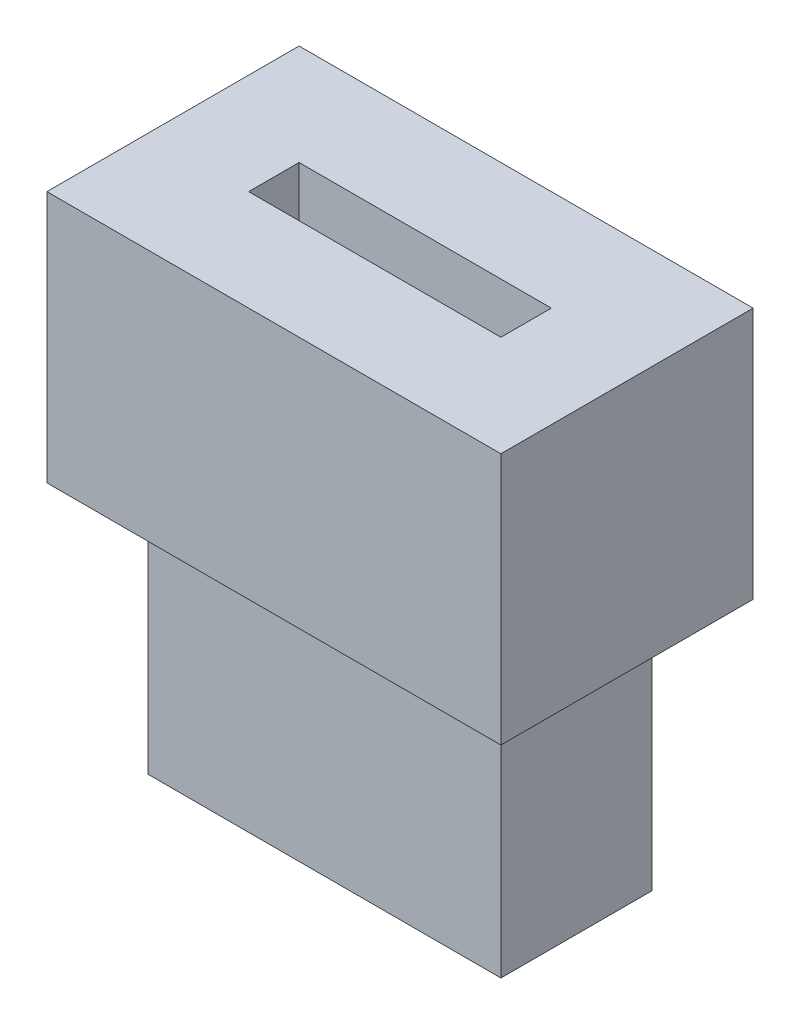
ISO-10303-21;
HEADER;
FILE_DESCRIPTION(('STEP AP214'),'2;1');
FILE_NAME('part.step','',(''),(''),'','','');
FILE_SCHEMA(('AUTOMOTIVE_DESIGN { 1 0 10303 214 1 1 1 1 }'));
ENDSEC;
DATA;
#1=APPLICATION_CONTEXT('core data for automotive mechanical design processes');
#2=APPLICATION_PROTOCOL_DEFINITION('international standard','automotive_design',2000,#1);
#3=PRODUCT_CONTEXT('',#1,'mechanical');
#4=PRODUCT('Part','Part','',(#3));
#5=PRODUCT_RELATED_PRODUCT_CATEGORY('part','',(#4));
#6=PRODUCT_DEFINITION_FORMATION('','',#4);
#7=PRODUCT_DEFINITION_CONTEXT('part definition',#1,'design');
#8=PRODUCT_DEFINITION('design','',#6,#7);
#9=PRODUCT_DEFINITION_SHAPE('','',#8);
#10=(LENGTH_UNIT() NAMED_UNIT(*) SI_UNIT(.MILLI.,.METRE.));
#11=(NAMED_UNIT(*) PLANE_ANGLE_UNIT() SI_UNIT($,.RADIAN.));
#12=(NAMED_UNIT(*) SI_UNIT($,.STERADIAN.) SOLID_ANGLE_UNIT());
#13=UNCERTAINTY_MEASURE_WITH_UNIT(LENGTH_MEASURE(1.E-05),#10,'distance_accuracy_value','');
#14=(GEOMETRIC_REPRESENTATION_CONTEXT(3) GLOBAL_UNCERTAINTY_ASSIGNED_CONTEXT((#13)) GLOBAL_UNIT_ASSIGNED_CONTEXT((#10,
#11,#12)) REPRESENTATION_CONTEXT('',''));
#15=CARTESIAN_POINT('',(0.,0.,0.));
#16=DIRECTION('',(0.,0.,1.));
#17=DIRECTION('',(1.,0.,0.));
#18=AXIS2_PLACEMENT_3D('',#15,#16,#17);
#19=CARTESIAN_POINT('',(0.,0.,0.));
#20=DIRECTION('',(0.,1.,0.));
#21=DIRECTION('',(0.,0.,1.));
#22=AXIS2_PLACEMENT_3D('',#19,#20,#21);
#23=PLANE('',#22);
#24=DIRECTION('',(1.,0.,0.));
#25=VECTOR('',#24,1.);
#26=CARTESIAN_POINT('',(0.,0.,12.5));
#27=LINE('',#26,#25);
#28=CARTESIAN_POINT('',(-22.5,0.,12.5));
#29=VERTEX_POINT('',#28);
#30=CARTESIAN_POINT('',(22.5,0.,12.5));
#31=VERTEX_POINT('',#30);
#32=EDGE_CURVE('E141',#29,#31,#27,.T.);
#33=ORIENTED_EDGE('',*,*,#32,.F.);
#34=DIRECTION('',(0.,0.,-1.));
#35=VECTOR('',#34,1.);
#36=CARTESIAN_POINT('',(-22.5,0.,0.));
#37=LINE('',#36,#35);
#38=CARTESIAN_POINT('',(-22.5,0.,-12.5));
#39=VERTEX_POINT('',#38);
#40=EDGE_CURVE('E147',#29,#39,#37,.T.);
#41=ORIENTED_EDGE('',*,*,#40,.T.);
#42=DIRECTION('',(1.,0.,0.));
#43=VECTOR('',#42,1.);
#44=CARTESIAN_POINT('',(0.,0.,-12.5));
#45=LINE('',#44,#43);
#46=CARTESIAN_POINT('',(22.5,0.,-12.5));
#47=VERTEX_POINT('',#46);
#48=EDGE_CURVE('E145',#39,#47,#45,.T.);
#49=ORIENTED_EDGE('',*,*,#48,.T.);
#50=DIRECTION('',(0.,0.,-1.));
#51=VECTOR('',#50,1.);
#52=CARTESIAN_POINT('',(22.5,0.,0.));
#53=LINE('',#52,#51);
#54=EDGE_CURVE('E128',#31,#47,#53,.T.);
#55=ORIENTED_EDGE('',*,*,#54,.F.);
#56=EDGE_LOOP('',(#33,#41,#49,#55));
#57=FACE_BOUND('',#56,.T.);
#58=DIRECTION('',(0.,0.,-1.));
#59=VECTOR('',#58,1.);
#60=CARTESIAN_POINT('',(-17.5,0.,0.));
#61=LINE('',#60,#59);
#62=CARTESIAN_POINT('',(-17.5,0.,7.5));
#63=VERTEX_POINT('',#62);
#64=CARTESIAN_POINT('',(-17.5,0.,-7.50000000000001));
#65=VERTEX_POINT('',#64);
#66=EDGE_CURVE('E206',#63,#65,#61,.T.);
#67=ORIENTED_EDGE('',*,*,#66,.F.);
#68=DIRECTION('',(1.,0.,0.));
#69=VECTOR('',#68,1.);
#70=CARTESIAN_POINT('',(0.,0.,7.5));
#71=LINE('',#70,#69);
#72=CARTESIAN_POINT('',(17.5,0.,7.5));
#73=VERTEX_POINT('',#72);
#74=EDGE_CURVE('E209',#63,#73,#71,.T.);
#75=ORIENTED_EDGE('',*,*,#74,.T.);
#76=DIRECTION('',(0.,0.,-1.));
#77=VECTOR('',#76,1.);
#78=CARTESIAN_POINT('',(17.5,0.,0.));
#79=LINE('',#78,#77);
#80=CARTESIAN_POINT('',(17.5,0.,-7.50000000000001));
#81=VERTEX_POINT('',#80);
#82=EDGE_CURVE('E60',#73,#81,#79,.T.);
#83=ORIENTED_EDGE('',*,*,#82,.T.);
#84=DIRECTION('',(1.,0.,0.));
#85=VECTOR('',#84,1.);
#86=CARTESIAN_POINT('',(0.,0.,-7.50000000000001));
#87=LINE('',#86,#85);
#88=EDGE_CURVE('E185',#65,#81,#87,.T.);
#89=ORIENTED_EDGE('',*,*,#88,.F.);
#90=EDGE_LOOP('',(#67,#75,#83,#89));
#91=FACE_BOUND('',#90,.T.);
#92=ADVANCED_FACE('F43',(#57,#91),#23,.F.);
#93=CARTESIAN_POINT('',(0.,25.,12.5));
#94=DIRECTION('',(0.,0.,-1.));
#95=DIRECTION('',(-1.,0.,0.));
#96=AXIS2_PLACEMENT_3D('',#93,#94,#95);
#97=PLANE('',#96);
#98=ORIENTED_EDGE('',*,*,#32,.T.);
#99=DIRECTION('',(0.,-1.,0.));
#100=VECTOR('',#99,1.);
#101=CARTESIAN_POINT('',(22.5,25.,12.5));
#102=LINE('',#101,#100);
#103=CARTESIAN_POINT('',(22.5,25.,12.5));
#104=VERTEX_POINT('',#103);
#105=EDGE_CURVE('E11',#104,#31,#102,.T.);
#106=ORIENTED_EDGE('',*,*,#105,.F.);
#107=DIRECTION('',(1.,0.,0.));
#108=VECTOR('',#107,1.);
#109=CARTESIAN_POINT('',(0.,25.,12.5));
#110=LINE('',#109,#108);
#111=CARTESIAN_POINT('',(-22.5,25.,12.5));
#112=VERTEX_POINT('',#111);
#113=EDGE_CURVE('E122',#112,#104,#110,.T.);
#114=ORIENTED_EDGE('',*,*,#113,.F.);
#115=DIRECTION('',(0.,-1.,0.));
#116=VECTOR('',#115,1.);
#117=CARTESIAN_POINT('',(-22.5,25.,12.5));
#118=LINE('',#117,#116);
#119=EDGE_CURVE('E69',#112,#29,#118,.T.);
#120=ORIENTED_EDGE('',*,*,#119,.T.);
#121=EDGE_LOOP('',(#98,#106,#114,#120));
#122=FACE_BOUND('',#121,.T.);
#123=ADVANCED_FACE('F271',(#122),#97,.F.);
#124=CARTESIAN_POINT('',(22.5,25.,0.));
#125=DIRECTION('',(-1.,0.,0.));
#126=DIRECTION('',(0.,0.,1.));
#127=AXIS2_PLACEMENT_3D('',#124,#125,#126);
#128=PLANE('',#127);
#129=ORIENTED_EDGE('',*,*,#54,.T.);
#130=DIRECTION('',(0.,-1.,0.));
#131=VECTOR('',#130,1.);
#132=CARTESIAN_POINT('',(22.5,25.,-12.5));
#133=LINE('',#132,#131);
#134=CARTESIAN_POINT('',(22.5,25.,-12.5));
#135=VERTEX_POINT('',#134);
#136=EDGE_CURVE('E52',#135,#47,#133,.T.);
#137=ORIENTED_EDGE('',*,*,#136,.F.);
#138=DIRECTION('',(0.,0.,-1.));
#139=VECTOR('',#138,1.);
#140=CARTESIAN_POINT('',(22.5,25.,0.));
#141=LINE('',#140,#139);
#142=EDGE_CURVE('E116',#104,#135,#141,.T.);
#143=ORIENTED_EDGE('',*,*,#142,.F.);
#144=ORIENTED_EDGE('',*,*,#105,.T.);
#145=EDGE_LOOP('',(#129,#137,#143,#144));
#146=FACE_BOUND('',#145,.T.);
#147=ADVANCED_FACE('F127',(#146),#128,.F.);
#148=CARTESIAN_POINT('',(0.,25.,-12.5));
#149=DIRECTION('',(0.,0.,-1.));
#150=DIRECTION('',(-1.,0.,0.));
#151=AXIS2_PLACEMENT_3D('',#148,#149,#150);
#152=PLANE('',#151);
#153=ORIENTED_EDGE('',*,*,#48,.F.);
#154=DIRECTION('',(0.,-1.,0.));
#155=VECTOR('',#154,1.);
#156=CARTESIAN_POINT('',(-22.5,25.,-12.5));
#157=LINE('',#156,#155);
#158=CARTESIAN_POINT('',(-22.5,25.,-12.5));
#159=VERTEX_POINT('',#158);
#160=EDGE_CURVE('E132',#159,#39,#157,.T.);
#161=ORIENTED_EDGE('',*,*,#160,.F.);
#162=DIRECTION('',(1.,0.,0.));
#163=VECTOR('',#162,1.);
#164=CARTESIAN_POINT('',(0.,25.,-12.5));
#165=LINE('',#164,#163);
#166=EDGE_CURVE('E121',#159,#135,#165,.T.);
#167=ORIENTED_EDGE('',*,*,#166,.T.);
#168=ORIENTED_EDGE('',*,*,#136,.T.);
#169=EDGE_LOOP('',(#153,#161,#167,#168));
#170=FACE_BOUND('',#169,.T.);
#171=ADVANCED_FACE('F134',(#170),#152,.T.);
#172=CARTESIAN_POINT('',(12.5,25.,0.));
#173=DIRECTION('',(-1.,0.,0.));
#174=DIRECTION('',(0.,0.,1.));
#175=AXIS2_PLACEMENT_3D('',#172,#173,#174);
#176=PLANE('',#175);
#177=DIRECTION('',(0.,-1.,0.));
#178=VECTOR('',#177,1.);
#179=CARTESIAN_POINT('',(12.5,25.,-2.5));
#180=LINE('',#179,#178);
#181=CARTESIAN_POINT('',(12.5,25.,-2.5));
#182=VERTEX_POINT('',#181);
#183=CARTESIAN_POINT('',(12.5,-25.,-2.5));
#184=VERTEX_POINT('',#183);
#185=EDGE_CURVE('E137',#182,#184,#180,.T.);
#186=ORIENTED_EDGE('',*,*,#185,.T.);
#187=DIRECTION('',(0.,0.,-1.));
#188=VECTOR('',#187,1.);
#189=CARTESIAN_POINT('',(12.5,-25.,0.));
#190=LINE('',#189,#188);
#191=CARTESIAN_POINT('',(12.5,-25.,2.5));
#192=VERTEX_POINT('',#191);
#193=EDGE_CURVE('E180',#192,#184,#190,.T.);
#194=ORIENTED_EDGE('',*,*,#193,.F.);
#195=DIRECTION('',(0.,-1.,0.));
#196=VECTOR('',#195,1.);
#197=CARTESIAN_POINT('',(12.5,25.,2.5));
#198=LINE('',#197,#196);
#199=CARTESIAN_POINT('',(12.5,25.,2.5));
#200=VERTEX_POINT('',#199);
#201=EDGE_CURVE('E47',#200,#192,#198,.T.);
#202=ORIENTED_EDGE('',*,*,#201,.F.);
#203=DIRECTION('',(0.,0.,-1.));
#204=VECTOR('',#203,1.);
#205=CARTESIAN_POINT('',(12.5,25.,0.));
#206=LINE('',#205,#204);
#207=EDGE_CURVE('E150',#200,#182,#206,.T.);
#208=ORIENTED_EDGE('',*,*,#207,.T.);
#209=EDGE_LOOP('',(#186,#194,#202,#208));
#210=FACE_BOUND('',#209,.T.);
#211=ADVANCED_FACE('F45',(#210),#176,.T.);
#212=CARTESIAN_POINT('',(0.,25.,2.5));
#213=DIRECTION('',(0.,0.,-1.));
#214=DIRECTION('',(-1.,0.,0.));
#215=AXIS2_PLACEMENT_3D('',#212,#213,#214);
#216=PLANE('',#215);
#217=ORIENTED_EDGE('',*,*,#201,.T.);
#218=DIRECTION('',(1.,0.,0.));
#219=VECTOR('',#218,1.);
#220=CARTESIAN_POINT('',(0.,-25.,2.5));
#221=LINE('',#220,#219);
#222=CARTESIAN_POINT('',(-12.5,-25.,2.5));
#223=VERTEX_POINT('',#222);
#224=EDGE_CURVE('E169',#223,#192,#221,.T.);
#225=ORIENTED_EDGE('',*,*,#224,.F.);
#226=DIRECTION('',(0.,-1.,0.));
#227=VECTOR('',#226,1.);
#228=CARTESIAN_POINT('',(-12.5,25.,2.5));
#229=LINE('',#228,#227);
#230=CARTESIAN_POINT('',(-12.5,25.,2.5));
#231=VERTEX_POINT('',#230);
#232=EDGE_CURVE('E157',#231,#223,#229,.T.);
#233=ORIENTED_EDGE('',*,*,#232,.F.);
#234=DIRECTION('',(1.,0.,0.));
#235=VECTOR('',#234,1.);
#236=CARTESIAN_POINT('',(0.,25.,2.5));
#237=LINE('',#236,#235);
#238=EDGE_CURVE('E172',#231,#200,#237,.T.);
#239=ORIENTED_EDGE('',*,*,#238,.T.);
#240=EDGE_LOOP('',(#217,#225,#233,#239));
#241=FACE_BOUND('',#240,.T.);
#242=ADVANCED_FACE('F168',(#241),#216,.T.);
#243=CARTESIAN_POINT('',(-12.5,25.,0.));
#244=DIRECTION('',(-1.,0.,0.));
#245=DIRECTION('',(0.,0.,1.));
#246=AXIS2_PLACEMENT_3D('',#243,#244,#245);
#247=PLANE('',#246);
#248=ORIENTED_EDGE('',*,*,#232,.T.);
#249=DIRECTION('',(0.,0.,-1.));
#250=VECTOR('',#249,1.);
#251=CARTESIAN_POINT('',(-12.5,-25.,0.));
#252=LINE('',#251,#250);
#253=CARTESIAN_POINT('',(-12.5,-25.,-2.5));
#254=VERTEX_POINT('',#253);
#255=EDGE_CURVE('E182',#223,#254,#252,.T.);
#256=ORIENTED_EDGE('',*,*,#255,.T.);
#257=DIRECTION('',(0.,-1.,0.));
#258=VECTOR('',#257,1.);
#259=CARTESIAN_POINT('',(-12.5,25.,-2.5));
#260=LINE('',#259,#258);
#261=CARTESIAN_POINT('',(-12.5,25.,-2.5));
#262=VERTEX_POINT('',#261);
#263=EDGE_CURVE('E155',#262,#254,#260,.T.);
#264=ORIENTED_EDGE('',*,*,#263,.F.);
#265=DIRECTION('',(0.,0.,-1.));
#266=VECTOR('',#265,1.);
#267=CARTESIAN_POINT('',(-12.5,25.,0.));
#268=LINE('',#267,#266);
#269=EDGE_CURVE('E223',#231,#262,#268,.T.);
#270=ORIENTED_EDGE('',*,*,#269,.F.);
#271=EDGE_LOOP('',(#248,#256,#264,#270));
#272=FACE_BOUND('',#271,.T.);
#273=ADVANCED_FACE('F292',(#272),#247,.F.);
#274=CARTESIAN_POINT('',(0.,25.,-2.5));
#275=DIRECTION('',(0.,0.,-1.));
#276=DIRECTION('',(-1.,0.,0.));
#277=AXIS2_PLACEMENT_3D('',#274,#275,#276);
#278=PLANE('',#277);
#279=ORIENTED_EDGE('',*,*,#263,.T.);
#280=DIRECTION('',(1.,0.,0.));
#281=VECTOR('',#280,1.);
#282=CARTESIAN_POINT('',(0.,-25.,-2.5));
#283=LINE('',#282,#281);
#284=EDGE_CURVE('E191',#254,#184,#283,.T.);
#285=ORIENTED_EDGE('',*,*,#284,.T.);
#286=ORIENTED_EDGE('',*,*,#185,.F.);
#287=DIRECTION('',(1.,0.,0.));
#288=VECTOR('',#287,1.);
#289=CARTESIAN_POINT('',(0.,25.,-2.5));
#290=LINE('',#289,#288);
#291=EDGE_CURVE('E225',#262,#182,#290,.T.);
#292=ORIENTED_EDGE('',*,*,#291,.F.);
#293=EDGE_LOOP('',(#279,#285,#286,#292));
#294=FACE_BOUND('',#293,.T.);
#295=ADVANCED_FACE('F230',(#294),#278,.F.);
#296=CARTESIAN_POINT('',(-22.5,25.,0.));
#297=DIRECTION('',(-1.,0.,0.));
#298=DIRECTION('',(0.,0.,1.));
#299=AXIS2_PLACEMENT_3D('',#296,#297,#298);
#300=PLANE('',#299);
#301=ORIENTED_EDGE('',*,*,#40,.F.);
#302=ORIENTED_EDGE('',*,*,#119,.F.);
#303=DIRECTION('',(0.,0.,-1.));
#304=VECTOR('',#303,1.);
#305=CARTESIAN_POINT('',(-22.5,25.,0.));
#306=LINE('',#305,#304);
#307=EDGE_CURVE('E135',#112,#159,#306,.T.);
#308=ORIENTED_EDGE('',*,*,#307,.T.);
#309=ORIENTED_EDGE('',*,*,#160,.T.);
#310=EDGE_LOOP('',(#301,#302,#308,#309));
#311=FACE_BOUND('',#310,.T.);
#312=ADVANCED_FACE('F283',(#311),#300,.T.);
#313=CARTESIAN_POINT('',(0.,25.,0.));
#314=DIRECTION('',(0.,1.,0.));
#315=DIRECTION('',(0.,0.,1.));
#316=AXIS2_PLACEMENT_3D('',#313,#314,#315);
#317=PLANE('',#316);
#318=ORIENTED_EDGE('',*,*,#207,.F.);
#319=ORIENTED_EDGE('',*,*,#238,.F.);
#320=ORIENTED_EDGE('',*,*,#269,.T.);
#321=ORIENTED_EDGE('',*,*,#291,.T.);
#322=EDGE_LOOP('',(#318,#319,#320,#321));
#323=FACE_BOUND('',#322,.T.);
#324=ORIENTED_EDGE('',*,*,#113,.T.);
#325=ORIENTED_EDGE('',*,*,#142,.T.);
#326=ORIENTED_EDGE('',*,*,#166,.F.);
#327=ORIENTED_EDGE('',*,*,#307,.F.);
#328=EDGE_LOOP('',(#324,#325,#326,#327));
#329=FACE_BOUND('',#328,.T.);
#330=ADVANCED_FACE('F118',(#323,#329),#317,.T.);
#331=CARTESIAN_POINT('',(-17.5,-25.,0.));
#332=DIRECTION('',(1.,0.,0.));
#333=DIRECTION('',(0.,0.,-1.));
#334=AXIS2_PLACEMENT_3D('',#331,#332,#333);
#335=PLANE('',#334);
#336=ORIENTED_EDGE('',*,*,#66,.T.);
#337=DIRECTION('',(0.,1.,0.));
#338=VECTOR('',#337,1.);
#339=CARTESIAN_POINT('',(-17.5,-25.,-7.50000000000001));
#340=LINE('',#339,#338);
#341=CARTESIAN_POINT('',(-17.5,-25.,-7.50000000000001));
#342=VERTEX_POINT('',#341);
#343=EDGE_CURVE('E143',#342,#65,#340,.T.);
#344=ORIENTED_EDGE('',*,*,#343,.F.);
#345=DIRECTION('',(0.,0.,-1.));
#346=VECTOR('',#345,1.);
#347=CARTESIAN_POINT('',(-17.5,-25.,0.));
#348=LINE('',#347,#346);
#349=CARTESIAN_POINT('',(-17.5,-25.,7.5));
#350=VERTEX_POINT('',#349);
#351=EDGE_CURVE('E193',#350,#342,#348,.T.);
#352=ORIENTED_EDGE('',*,*,#351,.F.);
#353=DIRECTION('',(0.,1.,0.));
#354=VECTOR('',#353,1.);
#355=CARTESIAN_POINT('',(-17.5,-25.,7.5));
#356=LINE('',#355,#354);
#357=EDGE_CURVE('E205',#350,#63,#356,.T.);
#358=ORIENTED_EDGE('',*,*,#357,.T.);
#359=EDGE_LOOP('',(#336,#344,#352,#358));
#360=FACE_BOUND('',#359,.T.);
#361=ADVANCED_FACE('F255',(#360),#335,.F.);
#362=CARTESIAN_POINT('',(0.,-25.,-7.50000000000001));
#363=DIRECTION('',(0.,0.,1.));
#364=DIRECTION('',(1.,0.,0.));
#365=AXIS2_PLACEMENT_3D('',#362,#363,#364);
#366=PLANE('',#365);
#367=ORIENTED_EDGE('',*,*,#88,.T.);
#368=DIRECTION('',(0.,1.,0.));
#369=VECTOR('',#368,1.);
#370=CARTESIAN_POINT('',(17.5,-25.,-7.50000000000001));
#371=LINE('',#370,#369);
#372=CARTESIAN_POINT('',(17.5,-25.,-7.50000000000001));
#373=VERTEX_POINT('',#372);
#374=EDGE_CURVE('E215',#373,#81,#371,.T.);
#375=ORIENTED_EDGE('',*,*,#374,.F.);
#376=DIRECTION('',(1.,0.,0.));
#377=VECTOR('',#376,1.);
#378=CARTESIAN_POINT('',(0.,-25.,-7.50000000000001));
#379=LINE('',#378,#377);
#380=EDGE_CURVE('E202',#342,#373,#379,.T.);
#381=ORIENTED_EDGE('',*,*,#380,.F.);
#382=ORIENTED_EDGE('',*,*,#343,.T.);
#383=EDGE_LOOP('',(#367,#375,#381,#382));
#384=FACE_BOUND('',#383,.T.);
#385=ADVANCED_FACE('F250',(#384),#366,.F.);
#386=CARTESIAN_POINT('',(17.5,-25.,0.));
#387=DIRECTION('',(1.,0.,0.));
#388=DIRECTION('',(0.,0.,-1.));
#389=AXIS2_PLACEMENT_3D('',#386,#387,#388);
#390=PLANE('',#389);
#391=ORIENTED_EDGE('',*,*,#82,.F.);
#392=DIRECTION('',(0.,1.,0.));
#393=VECTOR('',#392,1.);
#394=CARTESIAN_POINT('',(17.5,-25.,7.5));
#395=LINE('',#394,#393);
#396=CARTESIAN_POINT('',(17.5,-25.,7.5));
#397=VERTEX_POINT('',#396);
#398=EDGE_CURVE('E217',#397,#73,#395,.T.);
#399=ORIENTED_EDGE('',*,*,#398,.F.);
#400=DIRECTION('',(0.,0.,-1.));
#401=VECTOR('',#400,1.);
#402=CARTESIAN_POINT('',(17.5,-25.,0.));
#403=LINE('',#402,#401);
#404=EDGE_CURVE('E199',#397,#373,#403,.T.);
#405=ORIENTED_EDGE('',*,*,#404,.T.);
#406=ORIENTED_EDGE('',*,*,#374,.T.);
#407=EDGE_LOOP('',(#391,#399,#405,#406));
#408=FACE_BOUND('',#407,.T.);
#409=ADVANCED_FACE('F262',(#408),#390,.T.);
#410=CARTESIAN_POINT('',(0.,-25.,7.5));
#411=DIRECTION('',(0.,0.,1.));
#412=DIRECTION('',(1.,0.,0.));
#413=AXIS2_PLACEMENT_3D('',#410,#411,#412);
#414=PLANE('',#413);
#415=ORIENTED_EDGE('',*,*,#74,.F.);
#416=ORIENTED_EDGE('',*,*,#357,.F.);
#417=DIRECTION('',(1.,0.,0.));
#418=VECTOR('',#417,1.);
#419=CARTESIAN_POINT('',(0.,-25.,7.5));
#420=LINE('',#419,#418);
#421=EDGE_CURVE('E196',#350,#397,#420,.T.);
#422=ORIENTED_EDGE('',*,*,#421,.T.);
#423=ORIENTED_EDGE('',*,*,#398,.T.);
#424=EDGE_LOOP('',(#415,#416,#422,#423));
#425=FACE_BOUND('',#424,.T.);
#426=ADVANCED_FACE('F259',(#425),#414,.T.);
#427=CARTESIAN_POINT('',(0.,-25.,0.));
#428=DIRECTION('',(0.,1.,0.));
#429=DIRECTION('',(0.,0.,1.));
#430=AXIS2_PLACEMENT_3D('',#427,#428,#429);
#431=PLANE('',#430);
#432=ORIENTED_EDGE('',*,*,#193,.T.);
#433=ORIENTED_EDGE('',*,*,#284,.F.);
#434=ORIENTED_EDGE('',*,*,#255,.F.);
#435=ORIENTED_EDGE('',*,*,#224,.T.);
#436=EDGE_LOOP('',(#432,#433,#434,#435));
#437=FACE_BOUND('',#436,.T.);
#438=ORIENTED_EDGE('',*,*,#351,.T.);
#439=ORIENTED_EDGE('',*,*,#380,.T.);
#440=ORIENTED_EDGE('',*,*,#404,.F.);
#441=ORIENTED_EDGE('',*,*,#421,.F.);
#442=EDGE_LOOP('',(#438,#439,#440,#441));
#443=FACE_BOUND('',#442,.T.);
#444=ADVANCED_FACE('F176',(#437,#443),#431,.F.);
#445=CLOSED_SHELL('',(#92,#123,#147,#171,#211,#242,#273,#295,#312,#330,#361,#385,#409,#426,#444));
#446=MANIFOLD_SOLID_BREP('B2',#445);
#447=ADVANCED_BREP_SHAPE_REPRESENTATION('',(#18,#446),#14);
#448=SHAPE_DEFINITION_REPRESENTATION(#9,#447);
ENDSEC;
END-ISO-10303-21;
